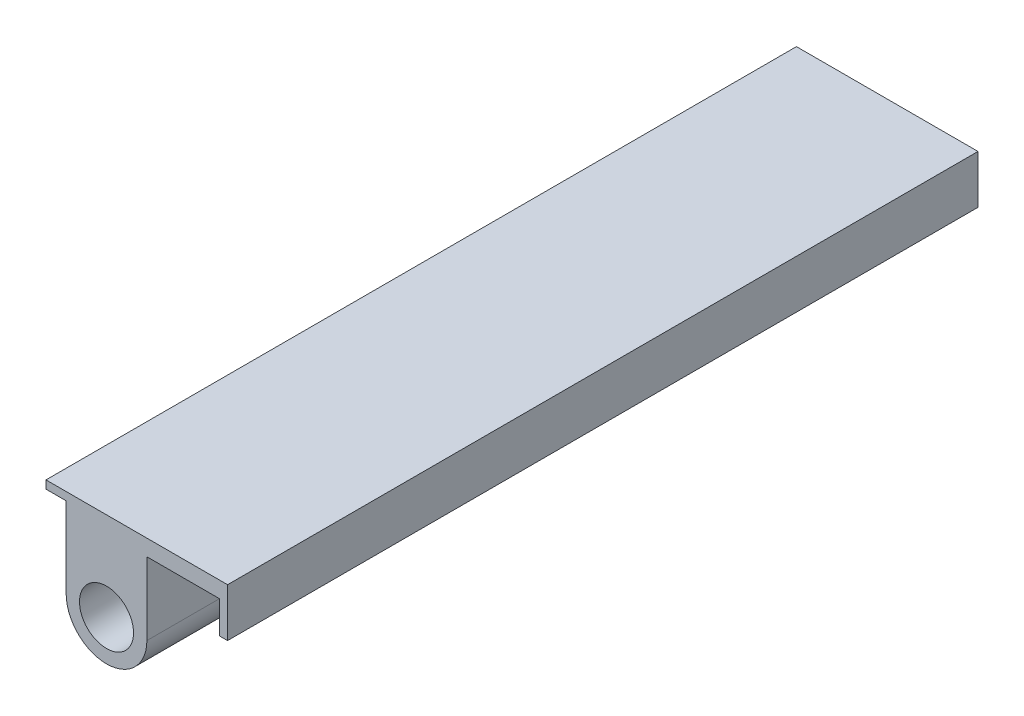
ISO-10303-21;
HEADER;
FILE_DESCRIPTION(('STEP AP214'),'2;1');
FILE_NAME('part.step','',(''),(''),'','','');
FILE_SCHEMA(('AUTOMOTIVE_DESIGN { 1 0 10303 214 1 1 1 1 }'));
ENDSEC;
DATA;
#1=APPLICATION_CONTEXT('core data for automotive mechanical design processes');
#2=APPLICATION_PROTOCOL_DEFINITION('international standard','automotive_design',2000,#1);
#3=PRODUCT_CONTEXT('',#1,'mechanical');
#4=PRODUCT('Part','Part','',(#3));
#5=PRODUCT_RELATED_PRODUCT_CATEGORY('part','',(#4));
#6=PRODUCT_DEFINITION_FORMATION('','',#4);
#7=PRODUCT_DEFINITION_CONTEXT('part definition',#1,'design');
#8=PRODUCT_DEFINITION('design','',#6,#7);
#9=PRODUCT_DEFINITION_SHAPE('','',#8);
#10=(LENGTH_UNIT() NAMED_UNIT(*) SI_UNIT(.MILLI.,.METRE.));
#11=(NAMED_UNIT(*) PLANE_ANGLE_UNIT() SI_UNIT($,.RADIAN.));
#12=(NAMED_UNIT(*) SI_UNIT($,.STERADIAN.) SOLID_ANGLE_UNIT());
#13=UNCERTAINTY_MEASURE_WITH_UNIT(LENGTH_MEASURE(1.E-05),#10,'distance_accuracy_value','');
#14=(GEOMETRIC_REPRESENTATION_CONTEXT(3) GLOBAL_UNCERTAINTY_ASSIGNED_CONTEXT((#13)) GLOBAL_UNIT_ASSIGNED_CONTEXT((#10,
#11,#12)) REPRESENTATION_CONTEXT('',''));
#15=CARTESIAN_POINT('',(0.,0.,0.));
#16=DIRECTION('',(0.,0.,1.));
#17=DIRECTION('',(1.,0.,0.));
#18=AXIS2_PLACEMENT_3D('',#15,#16,#17);
#19=CARTESIAN_POINT('',(-2.5,1.,0.));
#20=DIRECTION('',(-1.,0.,0.));
#21=DIRECTION('',(0.,-1.,0.));
#22=AXIS2_PLACEMENT_3D('',#19,#20,#21);
#23=PLANE('',#22);
#24=DIRECTION('',(0.,-1.,0.));
#25=VECTOR('',#24,1.);
#26=CARTESIAN_POINT('',(-2.5,1.,93.));
#27=LINE('',#26,#25);
#28=CARTESIAN_POINT('',(-2.5,1.,93.));
#29=VERTEX_POINT('',#28);
#30=CARTESIAN_POINT('',(-2.5,0.,93.));
#31=VERTEX_POINT('',#30);
#32=EDGE_CURVE('E144',#29,#31,#27,.T.);
#33=ORIENTED_EDGE('',*,*,#32,.F.);
#34=DIRECTION('',(0.,0.,1.));
#35=VECTOR('',#34,1.);
#36=CARTESIAN_POINT('',(-2.5,1.,0.));
#37=LINE('',#36,#35);
#38=CARTESIAN_POINT('',(-2.5,1.,0.));
#39=VERTEX_POINT('',#38);
#40=EDGE_CURVE('E11',#39,#29,#37,.T.);
#41=ORIENTED_EDGE('',*,*,#40,.F.);
#42=DIRECTION('',(0.,-1.,0.));
#43=VECTOR('',#42,1.);
#44=CARTESIAN_POINT('',(-2.5,1.,0.));
#45=LINE('',#44,#43);
#46=CARTESIAN_POINT('',(-2.5,0.,0.));
#47=VERTEX_POINT('',#46);
#48=EDGE_CURVE('E171',#39,#47,#45,.T.);
#49=ORIENTED_EDGE('',*,*,#48,.T.);
#50=DIRECTION('',(0.,0.,1.));
#51=VECTOR('',#50,1.);
#52=CARTESIAN_POINT('',(-2.5,0.,0.));
#53=LINE('',#52,#51);
#54=EDGE_CURVE('E38',#47,#31,#53,.T.);
#55=ORIENTED_EDGE('',*,*,#54,.T.);
#56=EDGE_LOOP('',(#33,#41,#49,#55));
#57=FACE_BOUND('',#56,.T.);
#58=ADVANCED_FACE('F35',(#57),#23,.T.);
#59=CARTESIAN_POINT('',(20.,1.,0.));
#60=DIRECTION('',(0.,1.,0.));
#61=DIRECTION('',(0.,0.,1.));
#62=AXIS2_PLACEMENT_3D('',#59,#60,#61);
#63=PLANE('',#62);
#64=DIRECTION('',(-1.,0.,0.));
#65=VECTOR('',#64,1.);
#66=CARTESIAN_POINT('',(20.,1.,93.));
#67=LINE('',#66,#65);
#68=CARTESIAN_POINT('',(20.,1.,93.));
#69=VERTEX_POINT('',#68);
#70=EDGE_CURVE('E169',#69,#29,#67,.T.);
#71=ORIENTED_EDGE('',*,*,#70,.F.);
#72=DIRECTION('',(0.,0.,1.));
#73=VECTOR('',#72,1.);
#74=CARTESIAN_POINT('',(20.,1.,0.));
#75=LINE('',#74,#73);
#76=CARTESIAN_POINT('',(20.,1.,0.));
#77=VERTEX_POINT('',#76);
#78=EDGE_CURVE('E44',#77,#69,#75,.T.);
#79=ORIENTED_EDGE('',*,*,#78,.F.);
#80=DIRECTION('',(-1.,0.,0.));
#81=VECTOR('',#80,1.);
#82=CARTESIAN_POINT('',(20.,1.,0.));
#83=LINE('',#82,#81);
#84=EDGE_CURVE('E134',#77,#39,#83,.T.);
#85=ORIENTED_EDGE('',*,*,#84,.T.);
#86=ORIENTED_EDGE('',*,*,#40,.T.);
#87=EDGE_LOOP('',(#71,#79,#85,#86));
#88=FACE_BOUND('',#87,.T.);
#89=ADVANCED_FACE('F187',(#88),#63,.T.);
#90=CARTESIAN_POINT('',(20.,-5.,0.));
#91=DIRECTION('',(1.,0.,0.));
#92=DIRECTION('',(0.,0.,-1.));
#93=AXIS2_PLACEMENT_3D('',#90,#91,#92);
#94=PLANE('',#93);
#95=DIRECTION('',(0.,1.,0.));
#96=VECTOR('',#95,1.);
#97=CARTESIAN_POINT('',(20.,-5.,93.));
#98=LINE('',#97,#96);
#99=CARTESIAN_POINT('',(20.,-5.,93.));
#100=VERTEX_POINT('',#99);
#101=EDGE_CURVE('E121',#100,#69,#98,.T.);
#102=ORIENTED_EDGE('',*,*,#101,.F.);
#103=DIRECTION('',(0.,0.,1.));
#104=VECTOR('',#103,1.);
#105=CARTESIAN_POINT('',(20.,-5.,0.));
#106=LINE('',#105,#104);
#107=CARTESIAN_POINT('',(20.,-5.,0.));
#108=VERTEX_POINT('',#107);
#109=EDGE_CURVE('E116',#108,#100,#106,.T.);
#110=ORIENTED_EDGE('',*,*,#109,.F.);
#111=DIRECTION('',(0.,1.,0.));
#112=VECTOR('',#111,1.);
#113=CARTESIAN_POINT('',(20.,-5.,0.));
#114=LINE('',#113,#112);
#115=EDGE_CURVE('E119',#108,#77,#114,.T.);
#116=ORIENTED_EDGE('',*,*,#115,.T.);
#117=ORIENTED_EDGE('',*,*,#78,.T.);
#118=EDGE_LOOP('',(#102,#110,#116,#117));
#119=FACE_BOUND('',#118,.T.);
#120=ADVANCED_FACE('F118',(#119),#94,.T.);
#121=CARTESIAN_POINT('',(19.,-5.,0.));
#122=DIRECTION('',(0.,-1.,0.));
#123=DIRECTION('',(0.,0.,-1.));
#124=AXIS2_PLACEMENT_3D('',#121,#122,#123);
#125=PLANE('',#124);
#126=DIRECTION('',(1.,0.,0.));
#127=VECTOR('',#126,1.);
#128=CARTESIAN_POINT('',(19.,-5.,93.));
#129=LINE('',#128,#127);
#130=CARTESIAN_POINT('',(19.,-5.,93.));
#131=VERTEX_POINT('',#130);
#132=EDGE_CURVE('E166',#131,#100,#129,.T.);
#133=ORIENTED_EDGE('',*,*,#132,.F.);
#134=DIRECTION('',(0.,0.,1.));
#135=VECTOR('',#134,1.);
#136=CARTESIAN_POINT('',(19.,-5.,0.));
#137=LINE('',#136,#135);
#138=CARTESIAN_POINT('',(19.,-5.,0.));
#139=VERTEX_POINT('',#138);
#140=EDGE_CURVE('E126',#139,#131,#137,.T.);
#141=ORIENTED_EDGE('',*,*,#140,.F.);
#142=DIRECTION('',(1.,0.,0.));
#143=VECTOR('',#142,1.);
#144=CARTESIAN_POINT('',(19.,-5.,0.));
#145=LINE('',#144,#143);
#146=EDGE_CURVE('E132',#139,#108,#145,.T.);
#147=ORIENTED_EDGE('',*,*,#146,.T.);
#148=ORIENTED_EDGE('',*,*,#109,.T.);
#149=EDGE_LOOP('',(#133,#141,#147,#148));
#150=FACE_BOUND('',#149,.T.);
#151=ADVANCED_FACE('F136',(#150),#125,.T.);
#152=CARTESIAN_POINT('',(19.,-1.,0.));
#153=DIRECTION('',(-1.,0.,0.));
#154=DIRECTION('',(0.,0.,1.));
#155=AXIS2_PLACEMENT_3D('',#152,#153,#154);
#156=PLANE('',#155);
#157=DIRECTION('',(0.,-1.,0.));
#158=VECTOR('',#157,1.);
#159=CARTESIAN_POINT('',(19.,-1.,93.));
#160=LINE('',#159,#158);
#161=CARTESIAN_POINT('',(19.,-1.,93.));
#162=VERTEX_POINT('',#161);
#163=EDGE_CURVE('E163',#162,#131,#160,.T.);
#164=ORIENTED_EDGE('',*,*,#163,.F.);
#165=DIRECTION('',(0.,0.,1.));
#166=VECTOR('',#165,1.);
#167=CARTESIAN_POINT('',(19.,-1.,0.));
#168=LINE('',#167,#166);
#169=CARTESIAN_POINT('',(19.,-1.,0.));
#170=VERTEX_POINT('',#169);
#171=EDGE_CURVE('E175',#170,#162,#168,.T.);
#172=ORIENTED_EDGE('',*,*,#171,.F.);
#173=DIRECTION('',(0.,-1.,0.));
#174=VECTOR('',#173,1.);
#175=CARTESIAN_POINT('',(19.,-1.,0.));
#176=LINE('',#175,#174);
#177=EDGE_CURVE('E137',#170,#139,#176,.T.);
#178=ORIENTED_EDGE('',*,*,#177,.T.);
#179=ORIENTED_EDGE('',*,*,#140,.T.);
#180=EDGE_LOOP('',(#164,#172,#178,#179));
#181=FACE_BOUND('',#180,.T.);
#182=ADVANCED_FACE('F200',(#181),#156,.T.);
#183=CARTESIAN_POINT('',(10.,-1.,0.));
#184=DIRECTION('',(0.,-1.,0.));
#185=DIRECTION('',(0.,0.,-1.));
#186=AXIS2_PLACEMENT_3D('',#183,#184,#185);
#187=PLANE('',#186);
#188=DIRECTION('',(1.,0.,0.));
#189=VECTOR('',#188,1.);
#190=CARTESIAN_POINT('',(10.,-1.,93.));
#191=LINE('',#190,#189);
#192=CARTESIAN_POINT('',(10.,-1.,93.));
#193=VERTEX_POINT('',#192);
#194=EDGE_CURVE('E160',#193,#162,#191,.T.);
#195=ORIENTED_EDGE('',*,*,#194,.F.);
#196=DIRECTION('',(0.,0.,1.));
#197=VECTOR('',#196,1.);
#198=CARTESIAN_POINT('',(10.,-1.,0.));
#199=LINE('',#198,#197);
#200=CARTESIAN_POINT('',(10.,-1.,0.));
#201=VERTEX_POINT('',#200);
#202=EDGE_CURVE('E177',#201,#193,#199,.T.);
#203=ORIENTED_EDGE('',*,*,#202,.F.);
#204=DIRECTION('',(1.,0.,0.));
#205=VECTOR('',#204,1.);
#206=CARTESIAN_POINT('',(10.,-1.,0.));
#207=LINE('',#206,#205);
#208=EDGE_CURVE('E139',#201,#170,#207,.T.);
#209=ORIENTED_EDGE('',*,*,#208,.T.);
#210=ORIENTED_EDGE('',*,*,#171,.T.);
#211=EDGE_LOOP('',(#195,#203,#209,#210));
#212=FACE_BOUND('',#211,.T.);
#213=ADVANCED_FACE('F203',(#212),#187,.T.);
#214=CARTESIAN_POINT('',(10.,-10.,0.));
#215=DIRECTION('',(1.,0.,0.));
#216=DIRECTION('',(0.,0.,-1.));
#217=AXIS2_PLACEMENT_3D('',#214,#215,#216);
#218=PLANE('',#217);
#219=DIRECTION('',(0.,1.,0.));
#220=VECTOR('',#219,1.);
#221=CARTESIAN_POINT('',(10.,-10.,93.));
#222=LINE('',#221,#220);
#223=CARTESIAN_POINT('',(10.,-10.,93.));
#224=VERTEX_POINT('',#223);
#225=EDGE_CURVE('E157',#224,#193,#222,.T.);
#226=ORIENTED_EDGE('',*,*,#225,.F.);
#227=DIRECTION('',(0.,0.,1.));
#228=VECTOR('',#227,1.);
#229=CARTESIAN_POINT('',(10.,-10.,0.));
#230=LINE('',#229,#228);
#231=CARTESIAN_POINT('',(10.,-10.,0.));
#232=VERTEX_POINT('',#231);
#233=EDGE_CURVE('E179',#232,#224,#230,.T.);
#234=ORIENTED_EDGE('',*,*,#233,.F.);
#235=DIRECTION('',(0.,1.,0.));
#236=VECTOR('',#235,1.);
#237=CARTESIAN_POINT('',(10.,-10.,0.));
#238=LINE('',#237,#236);
#239=EDGE_CURVE('E252',#232,#201,#238,.T.);
#240=ORIENTED_EDGE('',*,*,#239,.T.);
#241=ORIENTED_EDGE('',*,*,#202,.T.);
#242=EDGE_LOOP('',(#226,#234,#240,#241));
#243=FACE_BOUND('',#242,.T.);
#244=ADVANCED_FACE('F207',(#243),#218,.T.);
#245=CARTESIAN_POINT('',(5.,-10.,0.));
#246=DIRECTION('',(0.,0.,1.));
#247=DIRECTION('',(1.,0.,0.));
#248=AXIS2_PLACEMENT_3D('',#245,#246,#247);
#249=CYLINDRICAL_SURFACE('',#248,5.);
#250=CARTESIAN_POINT('',(5.,-10.,93.));
#251=DIRECTION('',(0.,0.,1.));
#252=DIRECTION('',(1.,0.,0.));
#253=AXIS2_PLACEMENT_3D('',#250,#251,#252);
#254=CIRCLE('',#253,5.);
#255=CARTESIAN_POINT('',(0.,-10.,93.));
#256=VERTEX_POINT('',#255);
#257=EDGE_CURVE('E154',#256,#224,#254,.T.);
#258=ORIENTED_EDGE('',*,*,#257,.F.);
#259=DIRECTION('',(0.,0.,1.));
#260=VECTOR('',#259,1.);
#261=CARTESIAN_POINT('',(0.,-10.,0.));
#262=LINE('',#261,#260);
#263=CARTESIAN_POINT('',(0.,-10.,0.));
#264=VERTEX_POINT('',#263);
#265=EDGE_CURVE('E181',#264,#256,#262,.T.);
#266=ORIENTED_EDGE('',*,*,#265,.F.);
#267=CARTESIAN_POINT('',(5.,-10.,0.));
#268=DIRECTION('',(0.,0.,1.));
#269=DIRECTION('',(1.,0.,0.));
#270=AXIS2_PLACEMENT_3D('',#267,#268,#269);
#271=CIRCLE('',#270,5.);
#272=EDGE_CURVE('E249',#264,#232,#271,.T.);
#273=ORIENTED_EDGE('',*,*,#272,.T.);
#274=ORIENTED_EDGE('',*,*,#233,.T.);
#275=EDGE_LOOP('',(#258,#266,#273,#274));
#276=FACE_BOUND('',#275,.T.);
#277=ADVANCED_FACE('F211',(#276),#249,.T.);
#278=CARTESIAN_POINT('',(0.,0.,0.));
#279=DIRECTION('',(-1.,0.,0.));
#280=DIRECTION('',(0.,0.,1.));
#281=AXIS2_PLACEMENT_3D('',#278,#279,#280);
#282=PLANE('',#281);
#283=DIRECTION('',(0.,-1.,0.));
#284=VECTOR('',#283,1.);
#285=CARTESIAN_POINT('',(0.,0.,93.));
#286=LINE('',#285,#284);
#287=CARTESIAN_POINT('',(0.,0.,93.));
#288=VERTEX_POINT('',#287);
#289=EDGE_CURVE('E151',#288,#256,#286,.T.);
#290=ORIENTED_EDGE('',*,*,#289,.F.);
#291=DIRECTION('',(0.,0.,1.));
#292=VECTOR('',#291,1.);
#293=CARTESIAN_POINT('',(0.,0.,0.));
#294=LINE('',#293,#292);
#295=CARTESIAN_POINT('',(0.,0.,0.));
#296=VERTEX_POINT('',#295);
#297=EDGE_CURVE('E182',#296,#288,#294,.T.);
#298=ORIENTED_EDGE('',*,*,#297,.F.);
#299=DIRECTION('',(0.,-1.,0.));
#300=VECTOR('',#299,1.);
#301=CARTESIAN_POINT('',(0.,0.,0.));
#302=LINE('',#301,#300);
#303=EDGE_CURVE('E246',#296,#264,#302,.T.);
#304=ORIENTED_EDGE('',*,*,#303,.T.);
#305=ORIENTED_EDGE('',*,*,#265,.T.);
#306=EDGE_LOOP('',(#290,#298,#304,#305));
#307=FACE_BOUND('',#306,.T.);
#308=ADVANCED_FACE('F215',(#307),#282,.T.);
#309=CARTESIAN_POINT('',(-2.5,0.,0.));
#310=DIRECTION('',(0.,-1.,0.));
#311=DIRECTION('',(0.,0.,-1.));
#312=AXIS2_PLACEMENT_3D('',#309,#310,#311);
#313=PLANE('',#312);
#314=DIRECTION('',(1.,0.,0.));
#315=VECTOR('',#314,1.);
#316=CARTESIAN_POINT('',(-2.5,0.,93.));
#317=LINE('',#316,#315);
#318=EDGE_CURVE('E147',#31,#288,#317,.T.);
#319=ORIENTED_EDGE('',*,*,#318,.F.);
#320=ORIENTED_EDGE('',*,*,#54,.F.);
#321=DIRECTION('',(1.,0.,0.));
#322=VECTOR('',#321,1.);
#323=CARTESIAN_POINT('',(-2.5,0.,0.));
#324=LINE('',#323,#322);
#325=EDGE_CURVE('E244',#47,#296,#324,.T.);
#326=ORIENTED_EDGE('',*,*,#325,.T.);
#327=ORIENTED_EDGE('',*,*,#297,.T.);
#328=EDGE_LOOP('',(#319,#320,#326,#327));
#329=FACE_BOUND('',#328,.T.);
#330=ADVANCED_FACE('F184',(#329),#313,.T.);
#331=CARTESIAN_POINT('',(5.,-10.,0.));
#332=DIRECTION('',(0.,0.,1.));
#333=DIRECTION('',(1.,0.,0.));
#334=AXIS2_PLACEMENT_3D('',#331,#332,#333);
#335=PLANE('',#334);
#336=CARTESIAN_POINT('',(5.,-10.,0.));
#337=DIRECTION('',(0.,0.,1.));
#338=DIRECTION('',(-1.,0.,0.));
#339=AXIS2_PLACEMENT_3D('',#336,#337,#338);
#340=CIRCLE('',#339,3.35);
#341=CARTESIAN_POINT('',(8.35,-10.,0.));
#342=VERTEX_POINT('',#341);
#343=EDGE_CURVE('E148',#342,#342,#340,.T.);
#344=ORIENTED_EDGE('',*,*,#343,.T.);
#345=EDGE_LOOP('',(#344));
#346=FACE_BOUND('',#345,.T.);
#347=ORIENTED_EDGE('',*,*,#48,.F.);
#348=ORIENTED_EDGE('',*,*,#84,.F.);
#349=ORIENTED_EDGE('',*,*,#115,.F.);
#350=ORIENTED_EDGE('',*,*,#146,.F.);
#351=ORIENTED_EDGE('',*,*,#177,.F.);
#352=ORIENTED_EDGE('',*,*,#208,.F.);
#353=ORIENTED_EDGE('',*,*,#239,.F.);
#354=ORIENTED_EDGE('',*,*,#272,.F.);
#355=ORIENTED_EDGE('',*,*,#303,.F.);
#356=ORIENTED_EDGE('',*,*,#325,.F.);
#357=EDGE_LOOP('',(#347,#348,#349,#350,#351,#352,#353,#354,#355,#356));
#358=FACE_BOUND('',#357,.T.);
#359=ADVANCED_FACE('F130',(#346,#358),#335,.F.);
#360=CARTESIAN_POINT('',(5.,-10.,93.));
#361=DIRECTION('',(0.,0.,1.));
#362=DIRECTION('',(1.,0.,0.));
#363=AXIS2_PLACEMENT_3D('',#360,#361,#362);
#364=PLANE('',#363);
#365=CARTESIAN_POINT('',(5.,-10.,93.));
#366=DIRECTION('',(0.,0.,1.));
#367=DIRECTION('',(-1.,0.,0.));
#368=AXIS2_PLACEMENT_3D('',#365,#366,#367);
#369=CIRCLE('',#368,3.35);
#370=CARTESIAN_POINT('',(8.35,-10.,93.));
#371=VERTEX_POINT('',#370);
#372=EDGE_CURVE('E239',#371,#371,#369,.T.);
#373=ORIENTED_EDGE('',*,*,#372,.F.);
#374=EDGE_LOOP('',(#373));
#375=FACE_BOUND('',#374,.T.);
#376=ORIENTED_EDGE('',*,*,#32,.T.);
#377=ORIENTED_EDGE('',*,*,#318,.T.);
#378=ORIENTED_EDGE('',*,*,#289,.T.);
#379=ORIENTED_EDGE('',*,*,#257,.T.);
#380=ORIENTED_EDGE('',*,*,#225,.T.);
#381=ORIENTED_EDGE('',*,*,#194,.T.);
#382=ORIENTED_EDGE('',*,*,#163,.T.);
#383=ORIENTED_EDGE('',*,*,#132,.T.);
#384=ORIENTED_EDGE('',*,*,#101,.T.);
#385=ORIENTED_EDGE('',*,*,#70,.T.);
#386=EDGE_LOOP('',(#376,#377,#378,#379,#380,#381,#382,#383,#384,#385));
#387=FACE_BOUND('',#386,.T.);
#388=ADVANCED_FACE('F186',(#375,#387),#364,.T.);
#389=CARTESIAN_POINT('',(5.,-10.,0.));
#390=DIRECTION('',(0.,0.,1.));
#391=DIRECTION('',(1.,0.,0.));
#392=AXIS2_PLACEMENT_3D('',#389,#390,#391);
#393=CYLINDRICAL_SURFACE('',#392,3.35);
#394=CARTESIAN_POINT('',(8.35,-10.,0.));
#395=CARTESIAN_POINT('',(8.35,-10.,0.968749999999999));
#396=CARTESIAN_POINT('',(8.35,-10.,1.9375));
#397=CARTESIAN_POINT('',(8.35,-10.,3.875));
#398=CARTESIAN_POINT('',(8.35,-10.,4.84375));
#399=CARTESIAN_POINT('',(8.35,-10.,6.78125));
#400=CARTESIAN_POINT('',(8.35,-10.,7.75));
#401=CARTESIAN_POINT('',(8.35,-10.,9.6875));
#402=CARTESIAN_POINT('',(8.35,-10.,10.65625));
#403=CARTESIAN_POINT('',(8.35,-10.,12.59375));
#404=CARTESIAN_POINT('',(8.35,-10.,13.5625));
#405=CARTESIAN_POINT('',(8.35,-10.,15.5));
#406=CARTESIAN_POINT('',(8.35,-10.,16.46875));
#407=CARTESIAN_POINT('',(8.35,-10.,18.40625));
#408=CARTESIAN_POINT('',(8.35,-10.,19.375));
#409=CARTESIAN_POINT('',(8.35,-10.,21.3125));
#410=CARTESIAN_POINT('',(8.35,-10.,22.28125));
#411=CARTESIAN_POINT('',(8.35,-10.,24.21875));
#412=CARTESIAN_POINT('',(8.35,-10.,25.1875));
#413=CARTESIAN_POINT('',(8.35,-10.,27.125));
#414=CARTESIAN_POINT('',(8.35,-10.,28.09375));
#415=CARTESIAN_POINT('',(8.35,-10.,30.03125));
#416=CARTESIAN_POINT('',(8.35,-10.,31.));
#417=CARTESIAN_POINT('',(8.35,-10.,32.9375));
#418=CARTESIAN_POINT('',(8.35,-10.,33.90625));
#419=CARTESIAN_POINT('',(8.35,-10.,35.84375));
#420=CARTESIAN_POINT('',(8.35,-10.,36.8125));
#421=CARTESIAN_POINT('',(8.35,-10.,38.75));
#422=CARTESIAN_POINT('',(8.35,-10.,39.71875));
#423=CARTESIAN_POINT('',(8.35,-10.,41.65625));
#424=CARTESIAN_POINT('',(8.35,-10.,42.625));
#425=CARTESIAN_POINT('',(8.35,-10.,44.5625));
#426=CARTESIAN_POINT('',(8.35,-10.,45.53125));
#427=CARTESIAN_POINT('',(8.35,-10.,47.46875));
#428=CARTESIAN_POINT('',(8.35,-10.,48.4375));
#429=CARTESIAN_POINT('',(8.35,-10.,50.375));
#430=CARTESIAN_POINT('',(8.35,-10.,51.34375));
#431=CARTESIAN_POINT('',(8.35,-10.,53.28125));
#432=CARTESIAN_POINT('',(8.35,-10.,54.25));
#433=CARTESIAN_POINT('',(8.35,-10.,56.1875));
#434=CARTESIAN_POINT('',(8.35,-10.,57.15625));
#435=CARTESIAN_POINT('',(8.35,-10.,59.09375));
#436=CARTESIAN_POINT('',(8.35,-10.,60.0625));
#437=CARTESIAN_POINT('',(8.35,-10.,62.));
#438=CARTESIAN_POINT('',(8.35,-10.,62.96875));
#439=CARTESIAN_POINT('',(8.35,-10.,64.90625));
#440=CARTESIAN_POINT('',(8.35,-10.,65.875));
#441=CARTESIAN_POINT('',(8.35,-10.,67.8125));
#442=CARTESIAN_POINT('',(8.35,-10.,68.78125));
#443=CARTESIAN_POINT('',(8.35,-10.,70.71875));
#444=CARTESIAN_POINT('',(8.35,-10.,71.6875));
#445=CARTESIAN_POINT('',(8.35,-10.,73.625));
#446=CARTESIAN_POINT('',(8.35,-10.,74.59375));
#447=CARTESIAN_POINT('',(8.35,-10.,76.53125));
#448=CARTESIAN_POINT('',(8.35,-10.,77.5));
#449=CARTESIAN_POINT('',(8.35,-10.,79.4375));
#450=CARTESIAN_POINT('',(8.35,-10.,80.40625));
#451=CARTESIAN_POINT('',(8.35,-10.,82.34375));
#452=CARTESIAN_POINT('',(8.35,-10.,83.3125));
#453=CARTESIAN_POINT('',(8.35,-10.,85.25));
#454=CARTESIAN_POINT('',(8.35,-10.,86.21875));
#455=CARTESIAN_POINT('',(8.35,-10.,88.15625));
#456=CARTESIAN_POINT('',(8.35,-10.,89.125));
#457=CARTESIAN_POINT('',(8.35,-10.,91.0625));
#458=CARTESIAN_POINT('',(8.35,-10.,92.03125));
#459=CARTESIAN_POINT('',(8.35,-10.,93.));
#460=B_SPLINE_CURVE_WITH_KNOTS('',3,(#394,#395,#396,#397,#398,#399,#400,#401,#402,#403,#404,
#405,#406,#407,#408,#409,#410,#411,#412,#413,#414,#415,#416,#417,#418,#419,#420,#421,#422,#423,
#424,#425,#426,#427,#428,#429,#430,#431,#432,#433,#434,#435,#436,#437,#438,#439,#440,#441,#442,
#443,#444,#445,#446,#447,#448,#449,#450,#451,#452,#453,#454,#455,#456,#457,#458,#459),
.UNSPECIFIED.,.F.,.F.,(4,2,2,2,2,2,2,2,2,2,2,2,2,2,2,2,2,2,2,2,2,2,2,2,2,2,2,2,2,2,2,2,4),(0.,
2.90625,5.8125,8.71875,11.625,14.53125,17.4375,20.34375,23.25,26.15625,29.0625,31.96875,34.875,
37.78125,40.6875,43.59375,46.5,49.40625,52.3125,55.21875,58.125,61.03125,63.9375,66.84375,69.75,
72.65625,75.5625,78.46875,81.375,84.28125,87.1875,90.09375,93.),.UNSPECIFIED.);
#461=EDGE_CURVE('BSEAM227',#342,#371,#460,.T.);
#462=ORIENTED_EDGE('',*,*,#343,.F.);
#463=ORIENTED_EDGE('',*,*,#372,.T.);
#464=ORIENTED_EDGE('',*,*,#461,.T.);
#465=ORIENTED_EDGE('',*,*,#461,.F.);
#466=EDGE_LOOP('',(#462,#464,#463,#465));
#467=FACE_BOUND('',#466,.T.);
#468=ADVANCED_FACE('F227',(#467),#393,.F.);
#469=CLOSED_SHELL('',(#58,#89,#120,#151,#182,#213,#244,#277,#308,#330,#359,#388,#468));
#470=MANIFOLD_SOLID_BREP('B2',#469);
#471=ADVANCED_BREP_SHAPE_REPRESENTATION('',(#18,#470),#14);
#472=SHAPE_DEFINITION_REPRESENTATION(#9,#471);
ENDSEC;
END-ISO-10303-21;
